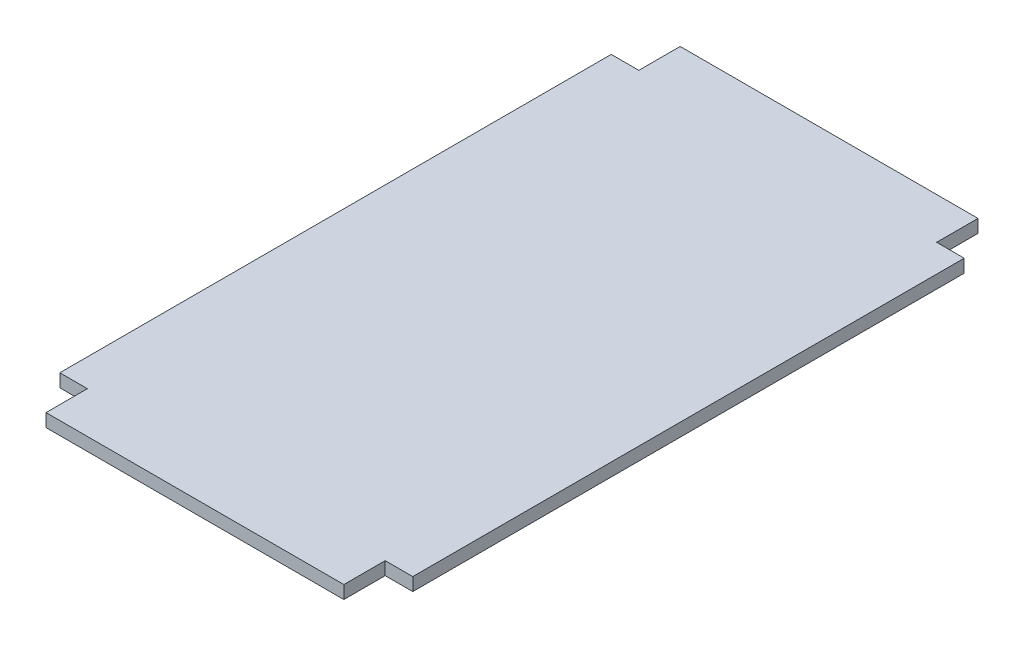
ISO-10303-21;
HEADER;
FILE_DESCRIPTION(('STEP AP214'),'2;1');
FILE_NAME('part.step','',(''),(''),'','','');
FILE_SCHEMA(('AUTOMOTIVE_DESIGN { 1 0 10303 214 1 1 1 1 }'));
ENDSEC;
DATA;
#1=APPLICATION_CONTEXT('core data for automotive mechanical design processes');
#2=APPLICATION_PROTOCOL_DEFINITION('international standard','automotive_design',2000,#1);
#3=PRODUCT_CONTEXT('',#1,'mechanical');
#4=PRODUCT('Part','Part','',(#3));
#5=PRODUCT_RELATED_PRODUCT_CATEGORY('part','',(#4));
#6=PRODUCT_DEFINITION_FORMATION('','',#4);
#7=PRODUCT_DEFINITION_CONTEXT('part definition',#1,'design');
#8=PRODUCT_DEFINITION('design','',#6,#7);
#9=PRODUCT_DEFINITION_SHAPE('','',#8);
#10=(LENGTH_UNIT() NAMED_UNIT(*) SI_UNIT(.MILLI.,.METRE.));
#11=(NAMED_UNIT(*) PLANE_ANGLE_UNIT() SI_UNIT($,.RADIAN.));
#12=(NAMED_UNIT(*) SI_UNIT($,.STERADIAN.) SOLID_ANGLE_UNIT());
#13=UNCERTAINTY_MEASURE_WITH_UNIT(LENGTH_MEASURE(1.E-05),#10,'distance_accuracy_value','');
#14=(GEOMETRIC_REPRESENTATION_CONTEXT(3) GLOBAL_UNCERTAINTY_ASSIGNED_CONTEXT((#13)) GLOBAL_UNIT_ASSIGNED_CONTEXT((#10,
#11,#12)) REPRESENTATION_CONTEXT('',''));
#15=CARTESIAN_POINT('',(0.,0.,0.));
#16=DIRECTION('',(0.,0.,1.));
#17=DIRECTION('',(1.,0.,0.));
#18=AXIS2_PLACEMENT_3D('',#15,#16,#17);
#19=CARTESIAN_POINT('',(34.2971374,2.9972,0.));
#20=DIRECTION('',(1.,0.,0.));
#21=DIRECTION('',(0.,0.,-1.));
#22=AXIS2_PLACEMENT_3D('',#19,#20,#21);
#23=PLANE('',#22);
#24=DIRECTION('',(0.,0.,1.));
#25=VECTOR('',#24,1.);
#26=CARTESIAN_POINT('',(34.2971374,0.,0.));
#27=LINE('',#26,#25);
#28=CARTESIAN_POINT('',(34.2971374,0.,-73.025));
#29=VERTEX_POINT('',#28);
#30=CARTESIAN_POINT('',(34.2971374,0.,-63.5));
#31=VERTEX_POINT('',#30);
#32=EDGE_CURVE('E155',#29,#31,#27,.T.);
#33=ORIENTED_EDGE('',*,*,#32,.F.);
#34=DIRECTION('',(0.,-1.,0.));
#35=VECTOR('',#34,1.);
#36=CARTESIAN_POINT('',(34.2971374,2.9972,-73.025));
#37=LINE('',#36,#35);
#38=CARTESIAN_POINT('',(34.2971374,2.9972,-73.025));
#39=VERTEX_POINT('',#38);
#40=EDGE_CURVE('E11',#39,#29,#37,.T.);
#41=ORIENTED_EDGE('',*,*,#40,.F.);
#42=DIRECTION('',(0.,0.,1.));
#43=VECTOR('',#42,1.);
#44=CARTESIAN_POINT('',(34.2971374,2.9972,0.));
#45=LINE('',#44,#43);
#46=CARTESIAN_POINT('',(34.2971374,2.9972,-63.5));
#47=VERTEX_POINT('',#46);
#48=EDGE_CURVE('E185',#39,#47,#45,.T.);
#49=ORIENTED_EDGE('',*,*,#48,.T.);
#50=DIRECTION('',(0.,-1.,0.));
#51=VECTOR('',#50,1.);
#52=CARTESIAN_POINT('',(34.2971374,2.9972,-63.5));
#53=LINE('',#52,#51);
#54=EDGE_CURVE('E98',#47,#31,#53,.T.);
#55=ORIENTED_EDGE('',*,*,#54,.T.);
#56=EDGE_LOOP('',(#33,#41,#49,#55));
#57=FACE_BOUND('',#56,.T.);
#58=ADVANCED_FACE('F36',(#57),#23,.T.);
#59=CARTESIAN_POINT('',(0.,2.9972,-73.025));
#60=DIRECTION('',(0.,0.,1.));
#61=DIRECTION('',(1.,0.,0.));
#62=AXIS2_PLACEMENT_3D('',#59,#60,#61);
#63=PLANE('',#62);
#64=DIRECTION('',(-1.,0.,0.));
#65=VECTOR('',#64,1.);
#66=CARTESIAN_POINT('',(0.,0.,-73.025));
#67=LINE('',#66,#65);
#68=CARTESIAN_POINT('',(-34.2971374,0.,-73.025));
#69=VERTEX_POINT('',#68);
#70=EDGE_CURVE('E158',#29,#69,#67,.T.);
#71=ORIENTED_EDGE('',*,*,#70,.T.);
#72=DIRECTION('',(0.,-1.,0.));
#73=VECTOR('',#72,1.);
#74=CARTESIAN_POINT('',(-34.2971374,2.9972,-73.025));
#75=LINE('',#74,#73);
#76=CARTESIAN_POINT('',(-34.2971374,2.9972,-73.025));
#77=VERTEX_POINT('',#76);
#78=EDGE_CURVE('E44',#77,#69,#75,.T.);
#79=ORIENTED_EDGE('',*,*,#78,.F.);
#80=DIRECTION('',(-1.,0.,0.));
#81=VECTOR('',#80,1.);
#82=CARTESIAN_POINT('',(0.,2.9972,-73.025));
#83=LINE('',#82,#81);
#84=EDGE_CURVE('E226',#39,#77,#83,.T.);
#85=ORIENTED_EDGE('',*,*,#84,.F.);
#86=ORIENTED_EDGE('',*,*,#40,.T.);
#87=EDGE_LOOP('',(#71,#79,#85,#86));
#88=FACE_BOUND('',#87,.T.);
#89=ADVANCED_FACE('F255',(#88),#63,.F.);
#90=CARTESIAN_POINT('',(-34.2971373999999,2.9972,0.));
#91=DIRECTION('',(1.,0.,0.));
#92=DIRECTION('',(0.,0.,-1.));
#93=AXIS2_PLACEMENT_3D('',#90,#91,#92);
#94=PLANE('',#93);
#95=DIRECTION('',(0.,0.,1.));
#96=VECTOR('',#95,1.);
#97=CARTESIAN_POINT('',(-34.2971373999999,0.,0.));
#98=LINE('',#97,#96);
#99=CARTESIAN_POINT('',(-34.2971374,0.,-63.5));
#100=VERTEX_POINT('',#99);
#101=EDGE_CURVE('E160',#69,#100,#98,.T.);
#102=ORIENTED_EDGE('',*,*,#101,.T.);
#103=DIRECTION('',(0.,-1.,0.));
#104=VECTOR('',#103,1.);
#105=CARTESIAN_POINT('',(-34.2971374,2.9972,-63.5));
#106=LINE('',#105,#104);
#107=CARTESIAN_POINT('',(-34.2971374,2.9972,-63.5));
#108=VERTEX_POINT('',#107);
#109=EDGE_CURVE('E199',#108,#100,#106,.T.);
#110=ORIENTED_EDGE('',*,*,#109,.F.);
#111=DIRECTION('',(0.,0.,1.));
#112=VECTOR('',#111,1.);
#113=CARTESIAN_POINT('',(-34.2971373999999,2.9972,0.));
#114=LINE('',#113,#112);
#115=EDGE_CURVE('E207',#77,#108,#114,.T.);
#116=ORIENTED_EDGE('',*,*,#115,.F.);
#117=ORIENTED_EDGE('',*,*,#78,.T.);
#118=EDGE_LOOP('',(#102,#110,#116,#117));
#119=FACE_BOUND('',#118,.T.);
#120=ADVANCED_FACE('F205',(#119),#94,.F.);
#121=CARTESIAN_POINT('',(0.,2.9972,-63.5));
#122=DIRECTION('',(0.,0.,-1.));
#123=DIRECTION('',(-1.,0.,0.));
#124=AXIS2_PLACEMENT_3D('',#121,#122,#123);
#125=PLANE('',#124);
#126=DIRECTION('',(1.,0.,0.));
#127=VECTOR('',#126,1.);
#128=CARTESIAN_POINT('',(0.,0.,-63.5));
#129=LINE('',#128,#127);
#130=CARTESIAN_POINT('',(-40.6471374,0.,-63.5));
#131=VERTEX_POINT('',#130);
#132=EDGE_CURVE('E163',#131,#100,#129,.T.);
#133=ORIENTED_EDGE('',*,*,#132,.F.);
#134=DIRECTION('',(0.,-1.,0.));
#135=VECTOR('',#134,1.);
#136=CARTESIAN_POINT('',(-40.6471374,2.9972,-63.5));
#137=LINE('',#136,#135);
#138=CARTESIAN_POINT('',(-40.6471374,2.9972,-63.5));
#139=VERTEX_POINT('',#138);
#140=EDGE_CURVE('E197',#139,#131,#137,.T.);
#141=ORIENTED_EDGE('',*,*,#140,.F.);
#142=DIRECTION('',(1.,0.,0.));
#143=VECTOR('',#142,1.);
#144=CARTESIAN_POINT('',(0.,2.9972,-63.5));
#145=LINE('',#144,#143);
#146=EDGE_CURVE('E219',#139,#108,#145,.T.);
#147=ORIENTED_EDGE('',*,*,#146,.T.);
#148=ORIENTED_EDGE('',*,*,#109,.T.);
#149=EDGE_LOOP('',(#133,#141,#147,#148));
#150=FACE_BOUND('',#149,.T.);
#151=ADVANCED_FACE('F216',(#150),#125,.T.);
#152=CARTESIAN_POINT('',(-40.6471374,2.9972,0.));
#153=DIRECTION('',(-1.,0.,0.));
#154=DIRECTION('',(0.,0.,1.));
#155=AXIS2_PLACEMENT_3D('',#152,#153,#154);
#156=PLANE('',#155);
#157=DIRECTION('',(0.,0.,-1.));
#158=VECTOR('',#157,1.);
#159=CARTESIAN_POINT('',(-40.6471374,0.,0.));
#160=LINE('',#159,#158);
#161=CARTESIAN_POINT('',(-40.6471374,0.,63.5));
#162=VERTEX_POINT('',#161);
#163=EDGE_CURVE('E166',#162,#131,#160,.T.);
#164=ORIENTED_EDGE('',*,*,#163,.F.);
#165=DIRECTION('',(0.,-1.,0.));
#166=VECTOR('',#165,1.);
#167=CARTESIAN_POINT('',(-40.6471374,2.9972,63.5));
#168=LINE('',#167,#166);
#169=CARTESIAN_POINT('',(-40.6471374,2.9972,63.5));
#170=VERTEX_POINT('',#169);
#171=EDGE_CURVE('E195',#170,#162,#168,.T.);
#172=ORIENTED_EDGE('',*,*,#171,.F.);
#173=DIRECTION('',(0.,0.,-1.));
#174=VECTOR('',#173,1.);
#175=CARTESIAN_POINT('',(-40.6471374,2.9972,0.));
#176=LINE('',#175,#174);
#177=EDGE_CURVE('E222',#170,#139,#176,.T.);
#178=ORIENTED_EDGE('',*,*,#177,.T.);
#179=ORIENTED_EDGE('',*,*,#140,.T.);
#180=EDGE_LOOP('',(#164,#172,#178,#179));
#181=FACE_BOUND('',#180,.T.);
#182=ADVANCED_FACE('F323',(#181),#156,.T.);
#183=CARTESIAN_POINT('',(0.,2.9972,63.5));
#184=DIRECTION('',(0.,0.,-1.));
#185=DIRECTION('',(-1.,0.,0.));
#186=AXIS2_PLACEMENT_3D('',#183,#184,#185);
#187=PLANE('',#186);
#188=DIRECTION('',(1.,0.,0.));
#189=VECTOR('',#188,1.);
#190=CARTESIAN_POINT('',(0.,0.,63.5));
#191=LINE('',#190,#189);
#192=CARTESIAN_POINT('',(-34.2971373999999,0.,63.5));
#193=VERTEX_POINT('',#192);
#194=EDGE_CURVE('E169',#162,#193,#191,.T.);
#195=ORIENTED_EDGE('',*,*,#194,.T.);
#196=DIRECTION('',(0.,-1.,0.));
#197=VECTOR('',#196,1.);
#198=CARTESIAN_POINT('',(-34.2971373999999,2.9972,63.5));
#199=LINE('',#198,#197);
#200=CARTESIAN_POINT('',(-34.2971373999999,2.9972,63.5));
#201=VERTEX_POINT('',#200);
#202=EDGE_CURVE('E193',#201,#193,#199,.T.);
#203=ORIENTED_EDGE('',*,*,#202,.F.);
#204=DIRECTION('',(1.,0.,0.));
#205=VECTOR('',#204,1.);
#206=CARTESIAN_POINT('',(0.,2.9972,63.5));
#207=LINE('',#206,#205);
#208=EDGE_CURVE('E224',#170,#201,#207,.T.);
#209=ORIENTED_EDGE('',*,*,#208,.F.);
#210=ORIENTED_EDGE('',*,*,#171,.T.);
#211=EDGE_LOOP('',(#195,#203,#209,#210));
#212=FACE_BOUND('',#211,.T.);
#213=ADVANCED_FACE('F314',(#212),#187,.F.);
#214=CARTESIAN_POINT('',(-34.2971373999999,2.9972,0.));
#215=DIRECTION('',(-1.,0.,0.));
#216=DIRECTION('',(0.,0.,1.));
#217=AXIS2_PLACEMENT_3D('',#214,#215,#216);
#218=PLANE('',#217);
#219=DIRECTION('',(0.,0.,-1.));
#220=VECTOR('',#219,1.);
#221=CARTESIAN_POINT('',(-34.2971373999999,0.,0.));
#222=LINE('',#221,#220);
#223=CARTESIAN_POINT('',(-34.2971373999999,0.,73.025));
#224=VERTEX_POINT('',#223);
#225=EDGE_CURVE('E172',#224,#193,#222,.T.);
#226=ORIENTED_EDGE('',*,*,#225,.F.);
#227=DIRECTION('',(0.,-1.,0.));
#228=VECTOR('',#227,1.);
#229=CARTESIAN_POINT('',(-34.2971373999999,2.9972,73.025));
#230=LINE('',#229,#228);
#231=CARTESIAN_POINT('',(-34.2971373999999,2.9972,73.025));
#232=VERTEX_POINT('',#231);
#233=EDGE_CURVE('E191',#232,#224,#230,.T.);
#234=ORIENTED_EDGE('',*,*,#233,.F.);
#235=DIRECTION('',(0.,0.,-1.));
#236=VECTOR('',#235,1.);
#237=CARTESIAN_POINT('',(-34.2971373999999,2.9972,0.));
#238=LINE('',#237,#236);
#239=EDGE_CURVE('E231',#232,#201,#238,.T.);
#240=ORIENTED_EDGE('',*,*,#239,.T.);
#241=ORIENTED_EDGE('',*,*,#202,.T.);
#242=EDGE_LOOP('',(#226,#234,#240,#241));
#243=FACE_BOUND('',#242,.T.);
#244=ADVANCED_FACE('F242',(#243),#218,.T.);
#245=CARTESIAN_POINT('',(0.,2.9972,73.025));
#246=DIRECTION('',(0.,0.,1.));
#247=DIRECTION('',(1.,0.,0.));
#248=AXIS2_PLACEMENT_3D('',#245,#246,#247);
#249=PLANE('',#248);
#250=DIRECTION('',(-1.,0.,0.));
#251=VECTOR('',#250,1.);
#252=CARTESIAN_POINT('',(0.,0.,73.025));
#253=LINE('',#252,#251);
#254=CARTESIAN_POINT('',(34.2971374,0.,73.025));
#255=VERTEX_POINT('',#254);
#256=EDGE_CURVE('E175',#255,#224,#253,.T.);
#257=ORIENTED_EDGE('',*,*,#256,.F.);
#258=DIRECTION('',(0.,-1.,0.));
#259=VECTOR('',#258,1.);
#260=CARTESIAN_POINT('',(34.2971374,2.9972,73.025));
#261=LINE('',#260,#259);
#262=CARTESIAN_POINT('',(34.2971374,2.9972,73.025));
#263=VERTEX_POINT('',#262);
#264=EDGE_CURVE('E189',#263,#255,#261,.T.);
#265=ORIENTED_EDGE('',*,*,#264,.F.);
#266=DIRECTION('',(-1.,0.,0.));
#267=VECTOR('',#266,1.);
#268=CARTESIAN_POINT('',(0.,2.9972,73.025));
#269=LINE('',#268,#267);
#270=EDGE_CURVE('E150',#263,#232,#269,.T.);
#271=ORIENTED_EDGE('',*,*,#270,.T.);
#272=ORIENTED_EDGE('',*,*,#233,.T.);
#273=EDGE_LOOP('',(#257,#265,#271,#272));
#274=FACE_BOUND('',#273,.T.);
#275=ADVANCED_FACE('F236',(#274),#249,.T.);
#276=CARTESIAN_POINT('',(34.2971374,2.9972,0.));
#277=DIRECTION('',(-1.,0.,0.));
#278=DIRECTION('',(0.,0.,1.));
#279=AXIS2_PLACEMENT_3D('',#276,#277,#278);
#280=PLANE('',#279);
#281=DIRECTION('',(0.,0.,-1.));
#282=VECTOR('',#281,1.);
#283=CARTESIAN_POINT('',(34.2971374,0.,0.));
#284=LINE('',#283,#282);
#285=CARTESIAN_POINT('',(34.2971374,0.,63.5));
#286=VERTEX_POINT('',#285);
#287=EDGE_CURVE('E178',#255,#286,#284,.T.);
#288=ORIENTED_EDGE('',*,*,#287,.T.);
#289=DIRECTION('',(0.,-1.,0.));
#290=VECTOR('',#289,1.);
#291=CARTESIAN_POINT('',(34.2971374,2.9972,63.5));
#292=LINE('',#291,#290);
#293=CARTESIAN_POINT('',(34.2971374,2.9972,63.5));
#294=VERTEX_POINT('',#293);
#295=EDGE_CURVE('E138',#294,#286,#292,.T.);
#296=ORIENTED_EDGE('',*,*,#295,.F.);
#297=DIRECTION('',(0.,0.,-1.));
#298=VECTOR('',#297,1.);
#299=CARTESIAN_POINT('',(34.2971374,2.9972,0.));
#300=LINE('',#299,#298);
#301=EDGE_CURVE('E147',#263,#294,#300,.T.);
#302=ORIENTED_EDGE('',*,*,#301,.F.);
#303=ORIENTED_EDGE('',*,*,#264,.T.);
#304=EDGE_LOOP('',(#288,#296,#302,#303));
#305=FACE_BOUND('',#304,.T.);
#306=ADVANCED_FACE('F245',(#305),#280,.F.);
#307=CARTESIAN_POINT('',(0.,2.9972,63.5));
#308=DIRECTION('',(0.,0.,1.));
#309=DIRECTION('',(1.,0.,0.));
#310=AXIS2_PLACEMENT_3D('',#307,#308,#309);
#311=PLANE('',#310);
#312=DIRECTION('',(-1.,0.,0.));
#313=VECTOR('',#312,1.);
#314=CARTESIAN_POINT('',(0.,0.,63.5));
#315=LINE('',#314,#313);
#316=CARTESIAN_POINT('',(40.6471374,0.,63.5));
#317=VERTEX_POINT('',#316);
#318=EDGE_CURVE('E137',#317,#286,#315,.T.);
#319=ORIENTED_EDGE('',*,*,#318,.F.);
#320=DIRECTION('',(0.,-1.,0.));
#321=VECTOR('',#320,1.);
#322=CARTESIAN_POINT('',(40.6471374,2.9972,63.5));
#323=LINE('',#322,#321);
#324=CARTESIAN_POINT('',(40.6471374,2.9972,63.5));
#325=VERTEX_POINT('',#324);
#326=EDGE_CURVE('E131',#325,#317,#323,.T.);
#327=ORIENTED_EDGE('',*,*,#326,.F.);
#328=DIRECTION('',(-1.,0.,0.));
#329=VECTOR('',#328,1.);
#330=CARTESIAN_POINT('',(0.,2.9972,63.5));
#331=LINE('',#330,#329);
#332=EDGE_CURVE('E135',#325,#294,#331,.T.);
#333=ORIENTED_EDGE('',*,*,#332,.T.);
#334=ORIENTED_EDGE('',*,*,#295,.T.);
#335=EDGE_LOOP('',(#319,#327,#333,#334));
#336=FACE_BOUND('',#335,.T.);
#337=ADVANCED_FACE('F133',(#336),#311,.T.);
#338=CARTESIAN_POINT('',(40.6471374,2.9972,0.));
#339=DIRECTION('',(-1.,0.,0.));
#340=DIRECTION('',(0.,0.,1.));
#341=AXIS2_PLACEMENT_3D('',#338,#339,#340);
#342=PLANE('',#341);
#343=DIRECTION('',(0.,0.,-1.));
#344=VECTOR('',#343,1.);
#345=CARTESIAN_POINT('',(40.6471374,0.,0.));
#346=LINE('',#345,#344);
#347=CARTESIAN_POINT('',(40.6471374,0.,-63.5));
#348=VERTEX_POINT('',#347);
#349=EDGE_CURVE('E91',#317,#348,#346,.T.);
#350=ORIENTED_EDGE('',*,*,#349,.T.);
#351=DIRECTION('',(0.,-1.,0.));
#352=VECTOR('',#351,1.);
#353=CARTESIAN_POINT('',(40.6471374,2.9972,-63.5));
#354=LINE('',#353,#352);
#355=CARTESIAN_POINT('',(40.6471374,2.9972,-63.5));
#356=VERTEX_POINT('',#355);
#357=EDGE_CURVE('E139',#356,#348,#354,.T.);
#358=ORIENTED_EDGE('',*,*,#357,.F.);
#359=DIRECTION('',(0.,0.,-1.));
#360=VECTOR('',#359,1.);
#361=CARTESIAN_POINT('',(40.6471374,2.9972,0.));
#362=LINE('',#361,#360);
#363=EDGE_CURVE('E141',#325,#356,#362,.T.);
#364=ORIENTED_EDGE('',*,*,#363,.F.);
#365=ORIENTED_EDGE('',*,*,#326,.T.);
#366=EDGE_LOOP('',(#350,#358,#364,#365));
#367=FACE_BOUND('',#366,.T.);
#368=ADVANCED_FACE('F142',(#367),#342,.F.);
#369=CARTESIAN_POINT('',(0.,2.9972,-63.5));
#370=DIRECTION('',(0.,0.,1.));
#371=DIRECTION('',(1.,0.,0.));
#372=AXIS2_PLACEMENT_3D('',#369,#370,#371);
#373=PLANE('',#372);
#374=DIRECTION('',(-1.,0.,0.));
#375=VECTOR('',#374,1.);
#376=CARTESIAN_POINT('',(0.,0.,-63.5));
#377=LINE('',#376,#375);
#378=EDGE_CURVE('E183',#348,#31,#377,.T.);
#379=ORIENTED_EDGE('',*,*,#378,.T.);
#380=ORIENTED_EDGE('',*,*,#54,.F.);
#381=DIRECTION('',(-1.,0.,0.));
#382=VECTOR('',#381,1.);
#383=CARTESIAN_POINT('',(0.,2.9972,-63.5));
#384=LINE('',#383,#382);
#385=EDGE_CURVE('E52',#356,#47,#384,.T.);
#386=ORIENTED_EDGE('',*,*,#385,.F.);
#387=ORIENTED_EDGE('',*,*,#357,.T.);
#388=EDGE_LOOP('',(#379,#380,#386,#387));
#389=FACE_BOUND('',#388,.T.);
#390=ADVANCED_FACE('F261',(#389),#373,.F.);
#391=CARTESIAN_POINT('',(0.,2.9972,0.));
#392=DIRECTION('',(0.,1.,0.));
#393=DIRECTION('',(0.,0.,1.));
#394=AXIS2_PLACEMENT_3D('',#391,#392,#393);
#395=PLANE('',#394);
#396=ORIENTED_EDGE('',*,*,#48,.F.);
#397=ORIENTED_EDGE('',*,*,#84,.T.);
#398=ORIENTED_EDGE('',*,*,#115,.T.);
#399=ORIENTED_EDGE('',*,*,#146,.F.);
#400=ORIENTED_EDGE('',*,*,#177,.F.);
#401=ORIENTED_EDGE('',*,*,#208,.T.);
#402=ORIENTED_EDGE('',*,*,#239,.F.);
#403=ORIENTED_EDGE('',*,*,#270,.F.);
#404=ORIENTED_EDGE('',*,*,#301,.T.);
#405=ORIENTED_EDGE('',*,*,#332,.F.);
#406=ORIENTED_EDGE('',*,*,#363,.T.);
#407=ORIENTED_EDGE('',*,*,#385,.T.);
#408=EDGE_LOOP('',(#396,#397,#398,#399,#400,#401,#402,#403,#404,#405,#406,#407));
#409=FACE_BOUND('',#408,.T.);
#410=ADVANCED_FACE('F144',(#409),#395,.T.);
#411=CARTESIAN_POINT('',(0.,0.,0.));
#412=DIRECTION('',(0.,1.,0.));
#413=DIRECTION('',(0.,0.,1.));
#414=AXIS2_PLACEMENT_3D('',#411,#412,#413);
#415=PLANE('',#414);
#416=ORIENTED_EDGE('',*,*,#32,.T.);
#417=ORIENTED_EDGE('',*,*,#378,.F.);
#418=ORIENTED_EDGE('',*,*,#349,.F.);
#419=ORIENTED_EDGE('',*,*,#318,.T.);
#420=ORIENTED_EDGE('',*,*,#287,.F.);
#421=ORIENTED_EDGE('',*,*,#256,.T.);
#422=ORIENTED_EDGE('',*,*,#225,.T.);
#423=ORIENTED_EDGE('',*,*,#194,.F.);
#424=ORIENTED_EDGE('',*,*,#163,.T.);
#425=ORIENTED_EDGE('',*,*,#132,.T.);
#426=ORIENTED_EDGE('',*,*,#101,.F.);
#427=ORIENTED_EDGE('',*,*,#70,.F.);
#428=EDGE_LOOP('',(#416,#417,#418,#419,#420,#421,#422,#423,#424,#425,#426,#427));
#429=FACE_BOUND('',#428,.T.);
#430=ADVANCED_FACE('F211',(#429),#415,.F.);
#431=CLOSED_SHELL('',(#58,#89,#120,#151,#182,#213,#244,#275,#306,#337,#368,#390,#410,#430));
#432=MANIFOLD_SOLID_BREP('B2',#431);
#433=ADVANCED_BREP_SHAPE_REPRESENTATION('',(#18,#432),#14);
#434=SHAPE_DEFINITION_REPRESENTATION(#9,#433);
ENDSEC;
END-ISO-10303-21;
